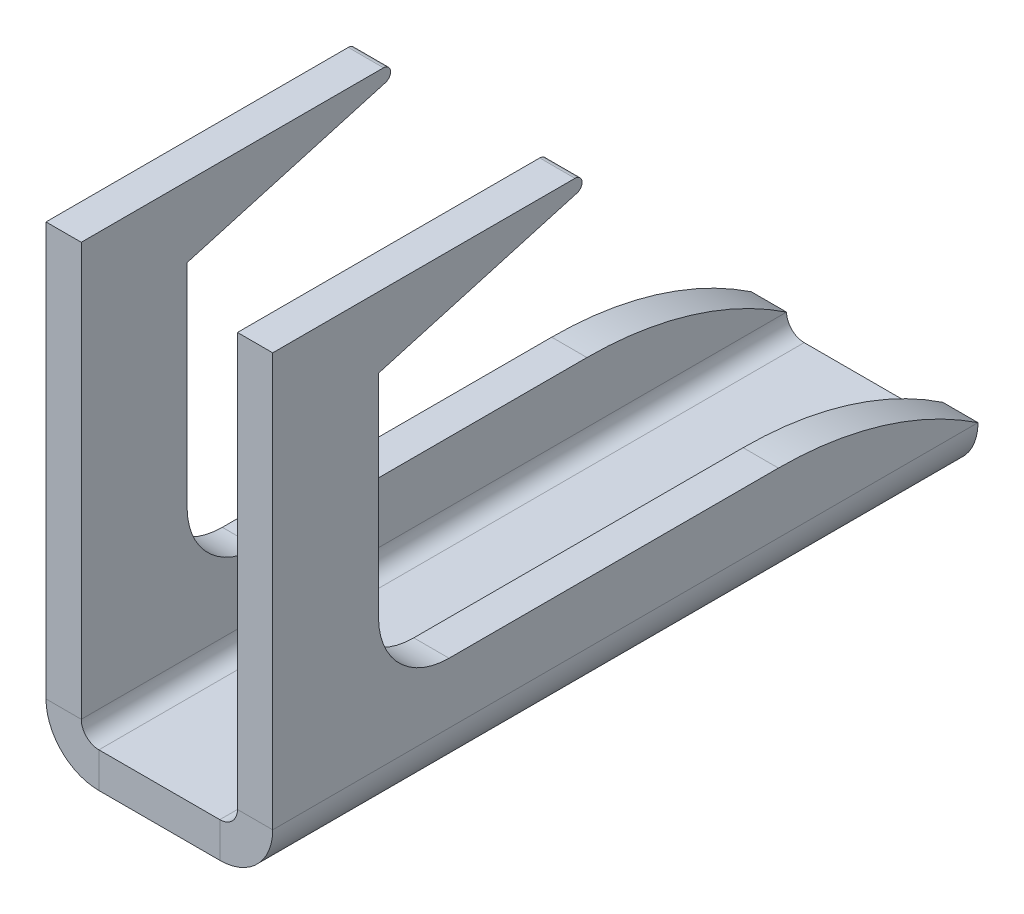
ISO-10303-21;
HEADER;
FILE_DESCRIPTION(('STEP AP214'),'2;1');
FILE_NAME('part.step','',(''),(''),'','','');
FILE_SCHEMA(('AUTOMOTIVE_DESIGN { 1 0 10303 214 1 1 1 1 }'));
ENDSEC;
DATA;
#1=APPLICATION_CONTEXT('core data for automotive mechanical design processes');
#2=APPLICATION_PROTOCOL_DEFINITION('international standard','automotive_design',2000,#1);
#3=PRODUCT_CONTEXT('',#1,'mechanical');
#4=PRODUCT('Part','Part','',(#3));
#5=PRODUCT_RELATED_PRODUCT_CATEGORY('part','',(#4));
#6=PRODUCT_DEFINITION_FORMATION('','',#4);
#7=PRODUCT_DEFINITION_CONTEXT('part definition',#1,'design');
#8=PRODUCT_DEFINITION('design','',#6,#7);
#9=PRODUCT_DEFINITION_SHAPE('','',#8);
#10=(LENGTH_UNIT() NAMED_UNIT(*) SI_UNIT(.MILLI.,.METRE.));
#11=(NAMED_UNIT(*) PLANE_ANGLE_UNIT() SI_UNIT($,.RADIAN.));
#12=(NAMED_UNIT(*) SI_UNIT($,.STERADIAN.) SOLID_ANGLE_UNIT());
#13=UNCERTAINTY_MEASURE_WITH_UNIT(LENGTH_MEASURE(1.E-05),#10,'distance_accuracy_value','');
#14=(GEOMETRIC_REPRESENTATION_CONTEXT(3) GLOBAL_UNCERTAINTY_ASSIGNED_CONTEXT((#13)) GLOBAL_UNIT_ASSIGNED_CONTEXT((#10,
#11,#12)) REPRESENTATION_CONTEXT('',''));
#15=CARTESIAN_POINT('',(0.,0.,0.));
#16=DIRECTION('',(0.,0.,1.));
#17=DIRECTION('',(1.,0.,0.));
#18=AXIS2_PLACEMENT_3D('',#15,#16,#17);
#19=CARTESIAN_POINT('',(5.,-1.,0.));
#20=DIRECTION('',(0.,0.,-1.));
#21=DIRECTION('',(-1.,0.,0.));
#22=AXIS2_PLACEMENT_3D('',#19,#20,#21);
#23=PLANE('',#22);
#24=DIRECTION('',(-1.,0.,0.));
#25=VECTOR('',#24,1.);
#26=CARTESIAN_POINT('',(5.,0.,0.));
#27=LINE('',#26,#25);
#28=CARTESIAN_POINT('',(1.71460183660255,0.,0.));
#29=VERTEX_POINT('',#28);
#30=CARTESIAN_POINT('',(-1.71460183660255,0.,0.));
#31=VERTEX_POINT('',#30);
#32=EDGE_CURVE('E332',#29,#31,#27,.T.);
#33=ORIENTED_EDGE('',*,*,#32,.F.);
#34=DIRECTION('',(0.,-1.,0.));
#35=VECTOR('',#34,1.);
#36=CARTESIAN_POINT('',(1.71460183660255,-1.,0.));
#37=LINE('',#36,#35);
#38=CARTESIAN_POINT('',(1.71460183660255,-1.,0.));
#39=VERTEX_POINT('',#38);
#40=EDGE_CURVE('E319',#29,#39,#37,.T.);
#41=ORIENTED_EDGE('',*,*,#40,.T.);
#42=DIRECTION('',(-1.,0.,0.));
#43=VECTOR('',#42,1.);
#44=CARTESIAN_POINT('',(5.,-1.,0.));
#45=LINE('',#44,#43);
#46=CARTESIAN_POINT('',(-1.71460183660255,-1.,0.));
#47=VERTEX_POINT('',#46);
#48=EDGE_CURVE('E307',#39,#47,#45,.T.);
#49=ORIENTED_EDGE('',*,*,#48,.T.);
#50=DIRECTION('',(0.,-1.,0.));
#51=VECTOR('',#50,1.);
#52=CARTESIAN_POINT('',(-1.71460183660255,-1.,0.));
#53=LINE('',#52,#51);
#54=EDGE_CURVE('E313',#31,#47,#53,.T.);
#55=ORIENTED_EDGE('',*,*,#54,.F.);
#56=EDGE_LOOP('',(#33,#41,#49,#55));
#57=FACE_BOUND('',#56,.T.);
#58=ADVANCED_FACE('F43',(#57),#23,.T.);
#59=CARTESIAN_POINT('',(-15.,-1.,20.));
#60=DIRECTION('',(0.,0.,1.));
#61=DIRECTION('',(1.,0.,0.));
#62=AXIS2_PLACEMENT_3D('',#59,#60,#61);
#63=PLANE('',#62);
#64=DIRECTION('',(1.,0.,0.));
#65=VECTOR('',#64,1.);
#66=CARTESIAN_POINT('',(-15.,-1.,20.));
#67=LINE('',#66,#65);
#68=CARTESIAN_POINT('',(-1.71460183660255,-1.,20.));
#69=VERTEX_POINT('',#68);
#70=CARTESIAN_POINT('',(1.71460183660255,-1.,20.));
#71=VERTEX_POINT('',#70);
#72=EDGE_CURVE('E329',#69,#71,#67,.T.);
#73=ORIENTED_EDGE('',*,*,#72,.T.);
#74=DIRECTION('',(0.,1.,0.));
#75=VECTOR('',#74,1.);
#76=CARTESIAN_POINT('',(1.71460183660255,-1.,20.));
#77=LINE('',#76,#75);
#78=CARTESIAN_POINT('',(1.71460183660255,0.,20.));
#79=VERTEX_POINT('',#78);
#80=EDGE_CURVE('E325',#71,#79,#77,.T.);
#81=ORIENTED_EDGE('',*,*,#80,.T.);
#82=DIRECTION('',(1.,0.,0.));
#83=VECTOR('',#82,1.);
#84=CARTESIAN_POINT('',(-15.,0.,20.));
#85=LINE('',#84,#83);
#86=CARTESIAN_POINT('',(-1.71460183660255,0.,20.));
#87=VERTEX_POINT('',#86);
#88=EDGE_CURVE('E298',#87,#79,#85,.T.);
#89=ORIENTED_EDGE('',*,*,#88,.F.);
#90=DIRECTION('',(0.,1.,0.));
#91=VECTOR('',#90,1.);
#92=CARTESIAN_POINT('',(-1.71460183660255,-1.,20.));
#93=LINE('',#92,#91);
#94=EDGE_CURVE('E306',#69,#87,#93,.T.);
#95=ORIENTED_EDGE('',*,*,#94,.F.);
#96=EDGE_LOOP('',(#73,#81,#89,#95));
#97=FACE_BOUND('',#96,.T.);
#98=ADVANCED_FACE('F401',(#97),#63,.T.);
#99=CARTESIAN_POINT('',(-7.,-1.,15.));
#100=DIRECTION('',(0.,-1.,0.));
#101=DIRECTION('',(0.,0.,-1.));
#102=AXIS2_PLACEMENT_3D('',#99,#100,#101);
#103=PLANE('',#102);
#104=ORIENTED_EDGE('',*,*,#48,.F.);
#105=DIRECTION('',(0.,0.,1.));
#106=VECTOR('',#105,1.);
#107=CARTESIAN_POINT('',(1.71460183660255,-1.,15.));
#108=LINE('',#107,#106);
#109=EDGE_CURVE('E316',#39,#71,#108,.T.);
#110=ORIENTED_EDGE('',*,*,#109,.T.);
#111=ORIENTED_EDGE('',*,*,#72,.F.);
#112=DIRECTION('',(0.,0.,1.));
#113=VECTOR('',#112,1.);
#114=CARTESIAN_POINT('',(-1.71460183660255,-1.,15.));
#115=LINE('',#114,#113);
#116=EDGE_CURVE('E303',#47,#69,#115,.T.);
#117=ORIENTED_EDGE('',*,*,#116,.F.);
#118=EDGE_LOOP('',(#104,#110,#111,#117));
#119=FACE_BOUND('',#118,.T.);
#120=ADVANCED_FACE('F408',(#119),#103,.T.);
#121=CARTESIAN_POINT('',(-7.,0.,15.));
#122=DIRECTION('',(0.,-1.,0.));
#123=DIRECTION('',(0.,0.,-1.));
#124=AXIS2_PLACEMENT_3D('',#121,#122,#123);
#125=PLANE('',#124);
#126=DIRECTION('',(0.,0.,1.));
#127=VECTOR('',#126,1.);
#128=CARTESIAN_POINT('',(1.71460183660255,0.,15.));
#129=LINE('',#128,#127);
#130=EDGE_CURVE('E322',#29,#79,#129,.T.);
#131=ORIENTED_EDGE('',*,*,#130,.F.);
#132=ORIENTED_EDGE('',*,*,#32,.T.);
#133=DIRECTION('',(0.,0.,1.));
#134=VECTOR('',#133,1.);
#135=CARTESIAN_POINT('',(-1.71460183660255,0.,15.));
#136=LINE('',#135,#134);
#137=EDGE_CURVE('E310',#31,#87,#136,.T.);
#138=ORIENTED_EDGE('',*,*,#137,.T.);
#139=ORIENTED_EDGE('',*,*,#88,.T.);
#140=EDGE_LOOP('',(#131,#132,#138,#139));
#141=FACE_BOUND('',#140,.T.);
#142=ADVANCED_FACE('F398',(#141),#125,.F.);
#143=CARTESIAN_POINT('',(-1.71460183660255,0.5,0.));
#144=DIRECTION('',(0.,0.,-1.));
#145=DIRECTION('',(-1.,0.,0.));
#146=AXIS2_PLACEMENT_3D('',#143,#144,#145);
#147=PLANE('',#146);
#148=DIRECTION('',(-1.,0.,0.));
#149=VECTOR('',#148,1.);
#150=CARTESIAN_POINT('',(-3.21460183660255,0.500000000000006,0.));
#151=LINE('',#150,#149);
#152=CARTESIAN_POINT('',(-2.21460183660255,0.500000000000002,0.));
#153=VERTEX_POINT('',#152);
#154=CARTESIAN_POINT('',(-3.21460183660255,0.500000000000007,0.));
#155=VERTEX_POINT('',#154);
#156=EDGE_CURVE('E239',#153,#155,#151,.T.);
#157=ORIENTED_EDGE('',*,*,#156,.F.);
#158=CARTESIAN_POINT('',(-1.71460183660255,0.5,0.));
#159=DIRECTION('',(0.,0.,-1.));
#160=DIRECTION('',(-1.,0.,0.));
#161=AXIS2_PLACEMENT_3D('',#158,#159,#160);
#162=CIRCLE('',#161,0.5);
#163=EDGE_CURVE('E242',#153,#31,#162,.F.);
#164=ORIENTED_EDGE('',*,*,#163,.T.);
#165=ORIENTED_EDGE('',*,*,#54,.T.);
#166=CARTESIAN_POINT('',(-1.71460183660255,0.5,0.));
#167=DIRECTION('',(0.,0.,1.));
#168=DIRECTION('',(-1.,0.,0.));
#169=AXIS2_PLACEMENT_3D('',#166,#167,#168);
#170=CIRCLE('',#169,1.5);
#171=EDGE_CURVE('E291',#155,#47,#170,.T.);
#172=ORIENTED_EDGE('',*,*,#171,.F.);
#173=EDGE_LOOP('',(#157,#164,#165,#172));
#174=FACE_BOUND('',#173,.T.);
#175=ADVANCED_FACE('F429',(#174),#147,.T.);
#176=CARTESIAN_POINT('',(-1.71460183660255,0.5,20.));
#177=DIRECTION('',(0.,0.,1.));
#178=DIRECTION('',(1.,0.,0.));
#179=AXIS2_PLACEMENT_3D('',#176,#177,#178);
#180=PLANE('',#179);
#181=CARTESIAN_POINT('',(-1.71460183660255,0.5,20.));
#182=DIRECTION('',(0.,0.,-1.));
#183=DIRECTION('',(-1.,0.,0.));
#184=AXIS2_PLACEMENT_3D('',#181,#182,#183);
#185=CIRCLE('',#184,0.5);
#186=CARTESIAN_POINT('',(-2.21460183660255,0.500000000000002,20.));
#187=VERTEX_POINT('',#186);
#188=EDGE_CURVE('E295',#87,#187,#185,.T.);
#189=ORIENTED_EDGE('',*,*,#188,.T.);
#190=DIRECTION('',(1.,0.,0.));
#191=VECTOR('',#190,1.);
#192=CARTESIAN_POINT('',(-3.21460183660255,0.500000000000006,20.));
#193=LINE('',#192,#191);
#194=CARTESIAN_POINT('',(-3.21460183660255,0.500000000000006,20.));
#195=VERTEX_POINT('',#194);
#196=EDGE_CURVE('E258',#195,#187,#193,.T.);
#197=ORIENTED_EDGE('',*,*,#196,.F.);
#198=CARTESIAN_POINT('',(-1.71460183660255,0.5,20.));
#199=DIRECTION('',(0.,0.,-1.));
#200=DIRECTION('',(1.,0.,0.));
#201=AXIS2_PLACEMENT_3D('',#198,#199,#200);
#202=CIRCLE('',#201,1.5);
#203=EDGE_CURVE('E294',#69,#195,#202,.T.);
#204=ORIENTED_EDGE('',*,*,#203,.F.);
#205=ORIENTED_EDGE('',*,*,#94,.T.);
#206=EDGE_LOOP('',(#189,#197,#204,#205));
#207=FACE_BOUND('',#206,.T.);
#208=ADVANCED_FACE('F416',(#207),#180,.T.);
#209=CARTESIAN_POINT('',(-1.71460183660255,0.5,30.0864979799932));
#210=DIRECTION('',(0.,0.,-1.));
#211=DIRECTION('',(-1.,0.,0.));
#212=AXIS2_PLACEMENT_3D('',#209,#210,#211);
#213=CYLINDRICAL_SURFACE('',#212,1.5);
#214=ORIENTED_EDGE('',*,*,#116,.T.);
#215=ORIENTED_EDGE('',*,*,#203,.T.);
#216=DIRECTION('',(0.,0.,1.));
#217=VECTOR('',#216,1.);
#218=CARTESIAN_POINT('',(-3.21460183660255,0.500000000000006,15.));
#219=LINE('',#218,#217);
#220=EDGE_CURVE('E264',#155,#195,#219,.T.);
#221=ORIENTED_EDGE('',*,*,#220,.F.);
#222=ORIENTED_EDGE('',*,*,#171,.T.);
#223=EDGE_LOOP('',(#214,#215,#221,#222));
#224=FACE_BOUND('',#223,.T.);
#225=ADVANCED_FACE('F411',(#224),#213,.T.);
#226=CARTESIAN_POINT('',(-1.71460183660255,0.5,30.0864979799932));
#227=DIRECTION('',(0.,0.,-1.));
#228=DIRECTION('',(-1.,0.,0.));
#229=AXIS2_PLACEMENT_3D('',#226,#227,#228);
#230=CYLINDRICAL_SURFACE('',#229,0.5);
#231=ORIENTED_EDGE('',*,*,#137,.F.);
#232=ORIENTED_EDGE('',*,*,#163,.F.);
#233=DIRECTION('',(0.,0.,1.));
#234=VECTOR('',#233,1.);
#235=CARTESIAN_POINT('',(-2.21460183660255,0.500000000000003,15.));
#236=LINE('',#235,#234);
#237=EDGE_CURVE('E235',#153,#187,#236,.T.);
#238=ORIENTED_EDGE('',*,*,#237,.T.);
#239=ORIENTED_EDGE('',*,*,#188,.F.);
#240=EDGE_LOOP('',(#231,#232,#238,#239));
#241=FACE_BOUND('',#240,.T.);
#242=ADVANCED_FACE('F425',(#241),#230,.F.);
#243=CARTESIAN_POINT('',(-3.21460183660254,2.21460183660256,0.));
#244=DIRECTION('',(0.,1.,0.));
#245=DIRECTION('',(0.,0.,1.));
#246=AXIS2_PLACEMENT_3D('',#243,#244,#245);
#247=PLANE('',#246);
#248=DIRECTION('',(0.,0.,1.));
#249=VECTOR('',#248,1.);
#250=CARTESIAN_POINT('',(-2.21460183660254,2.21460183660255,0.));
#251=LINE('',#250,#249);
#252=CARTESIAN_POINT('',(-2.21460183660254,2.21460183660255,5.66021360097048));
#253=VERTEX_POINT('',#252);
#254=CARTESIAN_POINT('',(-2.21460183660254,2.21460183660255,15.));
#255=VERTEX_POINT('',#254);
#256=EDGE_CURVE('E256',#253,#255,#251,.T.);
#257=ORIENTED_EDGE('',*,*,#256,.F.);
#258=DIRECTION('',(1.,0.,0.));
#259=VECTOR('',#258,1.);
#260=CARTESIAN_POINT('',(-3.21460183660254,2.21460183660256,5.66021360097048));
#261=LINE('',#260,#259);
#262=CARTESIAN_POINT('',(-3.21460183660254,2.21460183660256,5.66021360097048));
#263=VERTEX_POINT('',#262);
#264=EDGE_CURVE('E51',#253,#263,#261,.F.);
#265=ORIENTED_EDGE('',*,*,#264,.T.);
#266=DIRECTION('',(0.,0.,1.));
#267=VECTOR('',#266,1.);
#268=CARTESIAN_POINT('',(-3.21460183660254,2.21460183660256,0.));
#269=LINE('',#268,#267);
#270=CARTESIAN_POINT('',(-3.21460183660254,2.21460183660255,15.));
#271=VERTEX_POINT('',#270);
#272=EDGE_CURVE('E287',#263,#271,#269,.T.);
#273=ORIENTED_EDGE('',*,*,#272,.T.);
#274=DIRECTION('',(1.,0.,0.));
#275=VECTOR('',#274,1.);
#276=CARTESIAN_POINT('',(-3.21460183660254,2.21460183660255,15.));
#277=LINE('',#276,#275);
#278=EDGE_CURVE('E284',#271,#255,#277,.T.);
#279=ORIENTED_EDGE('',*,*,#278,.T.);
#280=EDGE_LOOP('',(#257,#265,#273,#279));
#281=FACE_BOUND('',#280,.T.);
#282=ADVANCED_FACE('F437',(#281),#247,.T.);
#283=CARTESIAN_POINT('',(-3.21460183660254,4.21460183660256,15.));
#284=DIRECTION('',(1.,0.,0.));
#285=DIRECTION('',(0.,0.,1.));
#286=AXIS2_PLACEMENT_3D('',#283,#284,#285);
#287=CYLINDRICAL_SURFACE('',#286,2.);
#288=CARTESIAN_POINT('',(-2.21460183660254,4.21460183660255,15.));
#289=DIRECTION('',(-1.,0.,0.));
#290=DIRECTION('',(0.,0.,-1.));
#291=AXIS2_PLACEMENT_3D('',#288,#289,#290);
#292=CIRCLE('',#291,2.);
#293=CARTESIAN_POINT('',(-2.21460183660254,4.21460183660255,17.));
#294=VERTEX_POINT('',#293);
#295=EDGE_CURVE('E253',#255,#294,#292,.T.);
#296=ORIENTED_EDGE('',*,*,#295,.F.);
#297=ORIENTED_EDGE('',*,*,#278,.F.);
#298=CARTESIAN_POINT('',(-3.21460183660254,4.21460183660256,15.));
#299=DIRECTION('',(-1.,0.,0.));
#300=DIRECTION('',(0.,0.,-1.));
#301=AXIS2_PLACEMENT_3D('',#298,#299,#300);
#302=CIRCLE('',#301,2.);
#303=CARTESIAN_POINT('',(-3.21460183660254,4.21460183660256,17.));
#304=VERTEX_POINT('',#303);
#305=EDGE_CURVE('E281',#271,#304,#302,.T.);
#306=ORIENTED_EDGE('',*,*,#305,.T.);
#307=DIRECTION('',(1.,0.,0.));
#308=VECTOR('',#307,1.);
#309=CARTESIAN_POINT('',(-3.21460183660254,4.21460183660256,17.));
#310=LINE('',#309,#308);
#311=EDGE_CURVE('E279',#304,#294,#310,.T.);
#312=ORIENTED_EDGE('',*,*,#311,.T.);
#313=EDGE_LOOP('',(#296,#297,#306,#312));
#314=FACE_BOUND('',#313,.T.);
#315=ADVANCED_FACE('F440',(#314),#287,.F.);
#316=CARTESIAN_POINT('',(-3.21460183660254,4.21460183660256,17.));
#317=DIRECTION('',(0.,0.,-1.));
#318=DIRECTION('',(0.,1.,0.));
#319=AXIS2_PLACEMENT_3D('',#316,#317,#318);
#320=PLANE('',#319);
#321=DIRECTION('',(0.,1.,0.));
#322=VECTOR('',#321,1.);
#323=CARTESIAN_POINT('',(-2.21460183660254,4.21460183660255,17.));
#324=LINE('',#323,#322);
#325=CARTESIAN_POINT('',(-2.21460183660251,10.2146018366026,17.));
#326=VERTEX_POINT('',#325);
#327=EDGE_CURVE('E250',#294,#326,#324,.T.);
#328=ORIENTED_EDGE('',*,*,#327,.F.);
#329=ORIENTED_EDGE('',*,*,#311,.F.);
#330=DIRECTION('',(0.,1.,0.));
#331=VECTOR('',#330,1.);
#332=CARTESIAN_POINT('',(-3.21460183660254,4.21460183660256,17.));
#333=LINE('',#332,#331);
#334=CARTESIAN_POINT('',(-3.21460183660251,10.2146018366026,17.));
#335=VERTEX_POINT('',#334);
#336=EDGE_CURVE('E276',#304,#335,#333,.T.);
#337=ORIENTED_EDGE('',*,*,#336,.T.);
#338=DIRECTION('',(1.,0.,0.));
#339=VECTOR('',#338,1.);
#340=CARTESIAN_POINT('',(-3.21460183660251,10.2146018366026,17.));
#341=LINE('',#340,#339);
#342=EDGE_CURVE('E274',#335,#326,#341,.T.);
#343=ORIENTED_EDGE('',*,*,#342,.T.);
#344=EDGE_LOOP('',(#328,#329,#337,#343));
#345=FACE_BOUND('',#344,.T.);
#346=ADVANCED_FACE('F444',(#345),#320,.T.);
#347=CARTESIAN_POINT('',(-3.21460183660251,10.2146018366026,17.));
#348=DIRECTION('',(0.,-0.961523947640823,-0.274721127897378));
#349=DIRECTION('',(0.,0.274721127897378,-0.961523947640823));
#350=AXIS2_PLACEMENT_3D('',#347,#348,#349);
#351=PLANE('',#350);
#352=DIRECTION('',(0.,0.274721127897378,-0.961523947640823));
#353=VECTOR('',#352,1.);
#354=CARTESIAN_POINT('',(-3.21460183660251,10.2146018366026,17.));
#355=LINE('',#354,#353);
#356=CARTESIAN_POINT('',(-3.21460183660251,11.8222970470744,11.3730667633486));
#357=VERTEX_POINT('',#356);
#358=EDGE_CURVE('E271',#335,#357,#355,.T.);
#359=ORIENTED_EDGE('',*,*,#358,.T.);
#360=DIRECTION('',(1.,0.,0.));
#361=VECTOR('',#360,1.);
#362=CARTESIAN_POINT('',(-3.21460183660251,11.8222970470744,11.3730667633486));
#363=LINE('',#362,#361);
#364=CARTESIAN_POINT('',(-2.21460183660251,11.8222970470744,11.3730667633486));
#365=VERTEX_POINT('',#364);
#366=EDGE_CURVE('E344',#357,#365,#363,.T.);
#367=ORIENTED_EDGE('',*,*,#366,.T.);
#368=DIRECTION('',(0.,0.274721127897378,-0.961523947640823));
#369=VECTOR('',#368,1.);
#370=CARTESIAN_POINT('',(-2.21460183660251,10.2146018366026,17.));
#371=LINE('',#370,#369);
#372=EDGE_CURVE('E247',#326,#365,#371,.T.);
#373=ORIENTED_EDGE('',*,*,#372,.F.);
#374=ORIENTED_EDGE('',*,*,#342,.F.);
#375=EDGE_LOOP('',(#359,#367,#373,#374));
#376=FACE_BOUND('',#375,.T.);
#377=ADVANCED_FACE('F447',(#376),#351,.T.);
#378=CARTESIAN_POINT('',(-3.21460183660251,12.2146018366026,10.));
#379=DIRECTION('',(0.,1.,0.));
#380=DIRECTION('',(0.,0.,1.));
#381=AXIS2_PLACEMENT_3D('',#378,#379,#380);
#382=PLANE('',#381);
#383=DIRECTION('',(0.,0.,1.));
#384=VECTOR('',#383,1.);
#385=CARTESIAN_POINT('',(-2.21460183660251,12.2146018366025,10.));
#386=LINE('',#385,#384);
#387=CARTESIAN_POINT('',(-2.21460183660251,12.2146018366025,11.4280109889281));
#388=VERTEX_POINT('',#387);
#389=CARTESIAN_POINT('',(-2.21460183660251,12.2146018366026,20.));
#390=VERTEX_POINT('',#389);
#391=EDGE_CURVE('E245',#388,#390,#386,.T.);
#392=ORIENTED_EDGE('',*,*,#391,.F.);
#393=DIRECTION('',(1.,0.,0.));
#394=VECTOR('',#393,1.);
#395=CARTESIAN_POINT('',(-3.21460183660251,12.2146018366026,11.4280109889281));
#396=LINE('',#395,#394);
#397=CARTESIAN_POINT('',(-3.21460183660251,12.2146018366026,11.4280109889281));
#398=VERTEX_POINT('',#397);
#399=EDGE_CURVE('E349',#388,#398,#396,.F.);
#400=ORIENTED_EDGE('',*,*,#399,.T.);
#401=DIRECTION('',(0.,0.,1.));
#402=VECTOR('',#401,1.);
#403=CARTESIAN_POINT('',(-3.21460183660251,12.2146018366026,10.));
#404=LINE('',#403,#402);
#405=CARTESIAN_POINT('',(-3.21460183660251,12.2146018366026,20.));
#406=VERTEX_POINT('',#405);
#407=EDGE_CURVE('E269',#398,#406,#404,.T.);
#408=ORIENTED_EDGE('',*,*,#407,.T.);
#409=DIRECTION('',(1.,0.,0.));
#410=VECTOR('',#409,1.);
#411=CARTESIAN_POINT('',(-3.21460183660251,12.2146018366026,20.));
#412=LINE('',#411,#410);
#413=EDGE_CURVE('E266',#406,#390,#412,.T.);
#414=ORIENTED_EDGE('',*,*,#413,.T.);
#415=EDGE_LOOP('',(#392,#400,#408,#414));
#416=FACE_BOUND('',#415,.T.);
#417=ADVANCED_FACE('F455',(#416),#382,.T.);
#418=CARTESIAN_POINT('',(-3.21460183660254,4.21460183660256,15.));
#419=DIRECTION('',(-1.,0.,0.));
#420=DIRECTION('',(0.,0.,-1.));
#421=AXIS2_PLACEMENT_3D('',#418,#419,#420);
#422=PLANE('',#421);
#423=ORIENTED_EDGE('',*,*,#272,.F.);
#424=CARTESIAN_POINT('',(-3.21460183660258,-7.98539816339744,5.66021360097048));
#425=DIRECTION('',(-1.,0.,0.));
#426=DIRECTION('',(0.,-1.,0.));
#427=AXIS2_PLACEMENT_3D('',#424,#425,#426);
#428=CIRCLE('',#427,10.2);
#429=EDGE_CURVE('E12',#263,#155,#428,.T.);
#430=ORIENTED_EDGE('',*,*,#429,.T.);
#431=ORIENTED_EDGE('',*,*,#220,.T.);
#432=DIRECTION('',(0.,-1.,0.));
#433=VECTOR('',#432,1.);
#434=CARTESIAN_POINT('',(-3.21460183660251,12.2146018366026,20.));
#435=LINE('',#434,#433);
#436=EDGE_CURVE('E261',#406,#195,#435,.T.);
#437=ORIENTED_EDGE('',*,*,#436,.F.);
#438=ORIENTED_EDGE('',*,*,#407,.F.);
#439=CARTESIAN_POINT('',(-3.21460183660251,12.0146018366026,11.4280109889281));
#440=DIRECTION('',(-1.,0.,0.));
#441=DIRECTION('',(0.,-1.,0.));
#442=AXIS2_PLACEMENT_3D('',#439,#440,#441);
#443=CIRCLE('',#442,0.2);
#444=EDGE_CURVE('E351',#398,#357,#443,.T.);
#445=ORIENTED_EDGE('',*,*,#444,.T.);
#446=ORIENTED_EDGE('',*,*,#358,.F.);
#447=ORIENTED_EDGE('',*,*,#336,.F.);
#448=ORIENTED_EDGE('',*,*,#305,.F.);
#449=EDGE_LOOP('',(#423,#430,#431,#437,#438,#445,#446,#447,#448));
#450=FACE_BOUND('',#449,.T.);
#451=ADVANCED_FACE('F433',(#450),#422,.T.);
#452=CARTESIAN_POINT('',(-3.21460183660251,12.2146018366026,20.));
#453=DIRECTION('',(0.,0.,1.));
#454=DIRECTION('',(0.,-1.,0.));
#455=AXIS2_PLACEMENT_3D('',#452,#453,#454);
#456=PLANE('',#455);
#457=ORIENTED_EDGE('',*,*,#436,.T.);
#458=ORIENTED_EDGE('',*,*,#196,.T.);
#459=DIRECTION('',(0.,-1.,0.));
#460=VECTOR('',#459,1.);
#461=CARTESIAN_POINT('',(-2.21460183660251,12.2146018366026,20.));
#462=LINE('',#461,#460);
#463=EDGE_CURVE('E243',#390,#187,#462,.T.);
#464=ORIENTED_EDGE('',*,*,#463,.F.);
#465=ORIENTED_EDGE('',*,*,#413,.F.);
#466=EDGE_LOOP('',(#457,#458,#464,#465));
#467=FACE_BOUND('',#466,.T.);
#468=ADVANCED_FACE('F420',(#467),#456,.T.);
#469=CARTESIAN_POINT('',(-2.21460183660254,4.21460183660255,15.));
#470=DIRECTION('',(-1.,0.,0.));
#471=DIRECTION('',(0.,0.,-1.));
#472=AXIS2_PLACEMENT_3D('',#469,#470,#471);
#473=PLANE('',#472);
#474=ORIENTED_EDGE('',*,*,#237,.F.);
#475=CARTESIAN_POINT('',(-2.21460183660258,-7.98539816339745,5.66021360097048));
#476=DIRECTION('',(-1.,0.,0.));
#477=DIRECTION('',(0.,-1.,0.));
#478=AXIS2_PLACEMENT_3D('',#475,#476,#477);
#479=CIRCLE('',#478,10.2);
#480=EDGE_CURVE('E65',#153,#253,#479,.F.);
#481=ORIENTED_EDGE('',*,*,#480,.T.);
#482=ORIENTED_EDGE('',*,*,#256,.T.);
#483=ORIENTED_EDGE('',*,*,#295,.T.);
#484=ORIENTED_EDGE('',*,*,#327,.T.);
#485=ORIENTED_EDGE('',*,*,#372,.T.);
#486=CARTESIAN_POINT('',(-2.21460183660251,12.0146018366025,11.4280109889281));
#487=DIRECTION('',(-1.,0.,0.));
#488=DIRECTION('',(0.,-1.,0.));
#489=AXIS2_PLACEMENT_3D('',#486,#487,#488);
#490=CIRCLE('',#489,0.2);
#491=EDGE_CURVE('E347',#365,#388,#490,.F.);
#492=ORIENTED_EDGE('',*,*,#491,.T.);
#493=ORIENTED_EDGE('',*,*,#391,.T.);
#494=ORIENTED_EDGE('',*,*,#463,.T.);
#495=EDGE_LOOP('',(#474,#481,#482,#483,#484,#485,#492,#493,#494));
#496=FACE_BOUND('',#495,.T.);
#497=ADVANCED_FACE('F427',(#496),#473,.F.);
#498=CARTESIAN_POINT('',(1.71460183660255,0.5,0.));
#499=DIRECTION('',(0.,0.,-1.));
#500=DIRECTION('',(-1.,0.,0.));
#501=AXIS2_PLACEMENT_3D('',#498,#499,#500);
#502=PLANE('',#501);
#503=ORIENTED_EDGE('',*,*,#40,.F.);
#504=CARTESIAN_POINT('',(1.71460183660255,0.5,0.));
#505=DIRECTION('',(0.,0.,1.));
#506=DIRECTION('',(1.,0.,0.));
#507=AXIS2_PLACEMENT_3D('',#504,#505,#506);
#508=CIRCLE('',#507,0.5);
#509=CARTESIAN_POINT('',(2.21460183660255,0.500000000000003,0.));
#510=VERTEX_POINT('',#509);
#511=EDGE_CURVE('E210',#29,#510,#508,.T.);
#512=ORIENTED_EDGE('',*,*,#511,.T.);
#513=DIRECTION('',(1.,0.,0.));
#514=VECTOR('',#513,1.);
#515=CARTESIAN_POINT('',(3.21460183660255,0.500000000000006,0.));
#516=LINE('',#515,#514);
#517=CARTESIAN_POINT('',(3.21460183660255,0.500000000000007,0.));
#518=VERTEX_POINT('',#517);
#519=EDGE_CURVE('E217',#510,#518,#516,.T.);
#520=ORIENTED_EDGE('',*,*,#519,.T.);
#521=CARTESIAN_POINT('',(1.71460183660255,0.5,0.));
#522=DIRECTION('',(0.,0.,1.));
#523=DIRECTION('',(-1.,0.,0.));
#524=AXIS2_PLACEMENT_3D('',#521,#522,#523);
#525=CIRCLE('',#524,1.5);
#526=EDGE_CURVE('E228',#39,#518,#525,.T.);
#527=ORIENTED_EDGE('',*,*,#526,.F.);
#528=EDGE_LOOP('',(#503,#512,#520,#527));
#529=FACE_BOUND('',#528,.T.);
#530=ADVANCED_FACE('F390',(#529),#502,.T.);
#531=CARTESIAN_POINT('',(1.71460183660255,0.5,20.));
#532=DIRECTION('',(0.,0.,1.));
#533=DIRECTION('',(1.,0.,0.));
#534=AXIS2_PLACEMENT_3D('',#531,#532,#533);
#535=PLANE('',#534);
#536=CARTESIAN_POINT('',(1.71460183660255,0.5,20.));
#537=DIRECTION('',(0.,0.,1.));
#538=DIRECTION('',(1.,0.,0.));
#539=AXIS2_PLACEMENT_3D('',#536,#537,#538);
#540=CIRCLE('',#539,0.5);
#541=CARTESIAN_POINT('',(2.21460183660255,0.500000000000002,20.));
#542=VERTEX_POINT('',#541);
#543=EDGE_CURVE('E232',#542,#79,#540,.F.);
#544=ORIENTED_EDGE('',*,*,#543,.T.);
#545=ORIENTED_EDGE('',*,*,#80,.F.);
#546=CARTESIAN_POINT('',(1.71460183660255,0.5,20.));
#547=DIRECTION('',(0.,0.,-1.));
#548=DIRECTION('',(1.,0.,0.));
#549=AXIS2_PLACEMENT_3D('',#546,#547,#548);
#550=CIRCLE('',#549,1.5);
#551=CARTESIAN_POINT('',(3.21460183660255,0.500000000000004,20.));
#552=VERTEX_POINT('',#551);
#553=EDGE_CURVE('E231',#552,#71,#550,.T.);
#554=ORIENTED_EDGE('',*,*,#553,.F.);
#555=DIRECTION('',(-1.,0.,0.));
#556=VECTOR('',#555,1.);
#557=CARTESIAN_POINT('',(3.21460183660255,0.500000000000006,20.));
#558=LINE('',#557,#556);
#559=EDGE_CURVE('E196',#552,#542,#558,.T.);
#560=ORIENTED_EDGE('',*,*,#559,.T.);
#561=EDGE_LOOP('',(#544,#545,#554,#560));
#562=FACE_BOUND('',#561,.T.);
#563=ADVANCED_FACE('F404',(#562),#535,.T.);
#564=CARTESIAN_POINT('',(1.71460183660255,0.5,-10.0864979799932));
#565=DIRECTION('',(0.,0.,1.));
#566=DIRECTION('',(1.,0.,0.));
#567=AXIS2_PLACEMENT_3D('',#564,#565,#566);
#568=CYLINDRICAL_SURFACE('',#567,1.5);
#569=DIRECTION('',(0.,0.,1.));
#570=VECTOR('',#569,1.);
#571=CARTESIAN_POINT('',(3.21460183660255,0.500000000000007,15.));
#572=LINE('',#571,#570);
#573=EDGE_CURVE('E226',#518,#552,#572,.T.);
#574=ORIENTED_EDGE('',*,*,#573,.T.);
#575=ORIENTED_EDGE('',*,*,#553,.T.);
#576=ORIENTED_EDGE('',*,*,#109,.F.);
#577=ORIENTED_EDGE('',*,*,#526,.T.);
#578=EDGE_LOOP('',(#574,#575,#576,#577));
#579=FACE_BOUND('',#578,.T.);
#580=ADVANCED_FACE('F406',(#579),#568,.T.);
#581=CARTESIAN_POINT('',(1.71460183660255,0.5,-10.0864979799932));
#582=DIRECTION('',(0.,0.,1.));
#583=DIRECTION('',(1.,0.,0.));
#584=AXIS2_PLACEMENT_3D('',#581,#582,#583);
#585=CYLINDRICAL_SURFACE('',#584,0.5);
#586=DIRECTION('',(0.,0.,1.));
#587=VECTOR('',#586,1.);
#588=CARTESIAN_POINT('',(2.21460183660255,0.500000000000003,15.));
#589=LINE('',#588,#587);
#590=EDGE_CURVE('E374',#510,#542,#589,.T.);
#591=ORIENTED_EDGE('',*,*,#590,.F.);
#592=ORIENTED_EDGE('',*,*,#511,.F.);
#593=ORIENTED_EDGE('',*,*,#130,.T.);
#594=ORIENTED_EDGE('',*,*,#543,.F.);
#595=EDGE_LOOP('',(#591,#592,#593,#594));
#596=FACE_BOUND('',#595,.T.);
#597=ADVANCED_FACE('F385',(#596),#585,.F.);
#598=CARTESIAN_POINT('',(3.21460183660251,12.2146018366026,10.));
#599=DIRECTION('',(0.,1.,0.));
#600=DIRECTION('',(0.,0.,-1.));
#601=AXIS2_PLACEMENT_3D('',#598,#599,#600);
#602=PLANE('',#601);
#603=DIRECTION('',(0.,0.,-1.));
#604=VECTOR('',#603,1.);
#605=CARTESIAN_POINT('',(3.21460183660251,12.2146018366026,10.));
#606=LINE('',#605,#604);
#607=CARTESIAN_POINT('',(3.21460183660251,12.2146018366026,20.));
#608=VERTEX_POINT('',#607);
#609=CARTESIAN_POINT('',(3.21460183660251,12.2146018366026,11.4280109889281));
#610=VERTEX_POINT('',#609);
#611=EDGE_CURVE('E206',#608,#610,#606,.T.);
#612=ORIENTED_EDGE('',*,*,#611,.T.);
#613=DIRECTION('',(-1.,0.,0.));
#614=VECTOR('',#613,1.);
#615=CARTESIAN_POINT('',(3.21460183660251,12.2146018366026,11.4280109889281));
#616=LINE('',#615,#614);
#617=CARTESIAN_POINT('',(2.21460183660251,12.2146018366026,11.4280109889281));
#618=VERTEX_POINT('',#617);
#619=EDGE_CURVE('E328',#610,#618,#616,.T.);
#620=ORIENTED_EDGE('',*,*,#619,.T.);
#621=DIRECTION('',(0.,0.,-1.));
#622=VECTOR('',#621,1.);
#623=CARTESIAN_POINT('',(2.21460183660251,12.2146018366026,10.));
#624=LINE('',#623,#622);
#625=CARTESIAN_POINT('',(2.21460183660251,12.2146018366026,20.));
#626=VERTEX_POINT('',#625);
#627=EDGE_CURVE('E209',#626,#618,#624,.T.);
#628=ORIENTED_EDGE('',*,*,#627,.F.);
#629=DIRECTION('',(-1.,0.,0.));
#630=VECTOR('',#629,1.);
#631=CARTESIAN_POINT('',(3.21460183660251,12.2146018366026,20.));
#632=LINE('',#631,#630);
#633=EDGE_CURVE('E193',#608,#626,#632,.T.);
#634=ORIENTED_EDGE('',*,*,#633,.F.);
#635=EDGE_LOOP('',(#612,#620,#628,#634));
#636=FACE_BOUND('',#635,.T.);
#637=ADVANCED_FACE('F204',(#636),#602,.T.);
#638=CARTESIAN_POINT('',(3.21460183660252,10.2146018366026,17.));
#639=DIRECTION('',(0.,-0.961523947640823,-0.274721127897378));
#640=DIRECTION('',(0.,-0.274721127897378,0.961523947640823));
#641=AXIS2_PLACEMENT_3D('',#638,#639,#640);
#642=PLANE('',#641);
#643=DIRECTION('',(0.,-0.274721127897378,0.961523947640823));
#644=VECTOR('',#643,1.);
#645=CARTESIAN_POINT('',(2.21460183660252,10.2146018366026,17.));
#646=LINE('',#645,#644);
#647=CARTESIAN_POINT('',(2.21460183660251,11.8222970470744,11.3730667633486));
#648=VERTEX_POINT('',#647);
#649=CARTESIAN_POINT('',(2.21460183660252,10.2146018366026,17.));
#650=VERTEX_POINT('',#649);
#651=EDGE_CURVE('E785',#648,#650,#646,.T.);
#652=ORIENTED_EDGE('',*,*,#651,.F.);
#653=DIRECTION('',(-1.,0.,0.));
#654=VECTOR('',#653,1.);
#655=CARTESIAN_POINT('',(3.21460183660251,11.8222970470744,11.3730667633486));
#656=LINE('',#655,#654);
#657=CARTESIAN_POINT('',(3.21460183660251,11.8222970470744,11.3730667633486));
#658=VERTEX_POINT('',#657);
#659=EDGE_CURVE('E341',#648,#658,#656,.F.);
#660=ORIENTED_EDGE('',*,*,#659,.T.);
#661=DIRECTION('',(0.,-0.274721127897378,0.961523947640823));
#662=VECTOR('',#661,1.);
#663=CARTESIAN_POINT('',(3.21460183660252,10.2146018366026,17.));
#664=LINE('',#663,#662);
#665=CARTESIAN_POINT('',(3.21460183660252,10.2146018366026,17.));
#666=VERTEX_POINT('',#665);
#667=EDGE_CURVE('E216',#658,#666,#664,.T.);
#668=ORIENTED_EDGE('',*,*,#667,.T.);
#669=DIRECTION('',(-1.,0.,0.));
#670=VECTOR('',#669,1.);
#671=CARTESIAN_POINT('',(3.21460183660252,10.2146018366026,17.));
#672=LINE('',#671,#670);
#673=EDGE_CURVE('E219',#666,#650,#672,.T.);
#674=ORIENTED_EDGE('',*,*,#673,.T.);
#675=EDGE_LOOP('',(#652,#660,#668,#674));
#676=FACE_BOUND('',#675,.T.);
#677=ADVANCED_FACE('F628',(#676),#642,.T.);
#678=CARTESIAN_POINT('',(3.21460183660254,4.21460183660256,17.));
#679=DIRECTION('',(0.,0.,-1.));
#680=DIRECTION('',(0.,-1.,0.));
#681=AXIS2_PLACEMENT_3D('',#678,#679,#680);
#682=PLANE('',#681);
#683=DIRECTION('',(0.,-1.,0.));
#684=VECTOR('',#683,1.);
#685=CARTESIAN_POINT('',(2.21460183660254,4.21460183660255,17.));
#686=LINE('',#685,#684);
#687=CARTESIAN_POINT('',(2.21460183660254,4.21460183660255,17.));
#688=VERTEX_POINT('',#687);
#689=EDGE_CURVE('E778',#650,#688,#686,.T.);
#690=ORIENTED_EDGE('',*,*,#689,.F.);
#691=ORIENTED_EDGE('',*,*,#673,.F.);
#692=DIRECTION('',(0.,-1.,0.));
#693=VECTOR('',#692,1.);
#694=CARTESIAN_POINT('',(3.21460183660254,4.21460183660256,17.));
#695=LINE('',#694,#693);
#696=CARTESIAN_POINT('',(3.21460183660254,4.21460183660256,17.));
#697=VERTEX_POINT('',#696);
#698=EDGE_CURVE('E797',#666,#697,#695,.T.);
#699=ORIENTED_EDGE('',*,*,#698,.T.);
#700=DIRECTION('',(-1.,0.,0.));
#701=VECTOR('',#700,1.);
#702=CARTESIAN_POINT('',(3.21460183660254,4.21460183660256,17.));
#703=LINE('',#702,#701);
#704=EDGE_CURVE('E782',#697,#688,#703,.T.);
#705=ORIENTED_EDGE('',*,*,#704,.T.);
#706=EDGE_LOOP('',(#690,#691,#699,#705));
#707=FACE_BOUND('',#706,.T.);
#708=ADVANCED_FACE('F633',(#707),#682,.T.);
#709=CARTESIAN_POINT('',(3.21460183660254,4.21460183660256,15.));
#710=DIRECTION('',(-1.,0.,0.));
#711=DIRECTION('',(0.,0.,1.));
#712=AXIS2_PLACEMENT_3D('',#709,#710,#711);
#713=CYLINDRICAL_SURFACE('',#712,2.);
#714=CARTESIAN_POINT('',(2.21460183660254,4.21460183660255,15.));
#715=DIRECTION('',(1.,0.,0.));
#716=DIRECTION('',(0.,0.,1.));
#717=AXIS2_PLACEMENT_3D('',#714,#715,#716);
#718=CIRCLE('',#717,2.);
#719=CARTESIAN_POINT('',(2.21460183660255,2.21460183660255,15.));
#720=VERTEX_POINT('',#719);
#721=EDGE_CURVE('E784',#688,#720,#718,.T.);
#722=ORIENTED_EDGE('',*,*,#721,.F.);
#723=ORIENTED_EDGE('',*,*,#704,.F.);
#724=CARTESIAN_POINT('',(3.21460183660254,4.21460183660256,15.));
#725=DIRECTION('',(1.,0.,0.));
#726=DIRECTION('',(0.,0.,1.));
#727=AXIS2_PLACEMENT_3D('',#724,#725,#726);
#728=CIRCLE('',#727,2.);
#729=CARTESIAN_POINT('',(3.21460183660255,2.21460183660256,15.));
#730=VERTEX_POINT('',#729);
#731=EDGE_CURVE('E794',#697,#730,#728,.T.);
#732=ORIENTED_EDGE('',*,*,#731,.T.);
#733=DIRECTION('',(-1.,0.,0.));
#734=VECTOR('',#733,1.);
#735=CARTESIAN_POINT('',(3.21460183660255,2.21460183660256,15.));
#736=LINE('',#735,#734);
#737=EDGE_CURVE('E373',#730,#720,#736,.T.);
#738=ORIENTED_EDGE('',*,*,#737,.T.);
#739=EDGE_LOOP('',(#722,#723,#732,#738));
#740=FACE_BOUND('',#739,.T.);
#741=ADVANCED_FACE('F522',(#740),#713,.F.);
#742=CARTESIAN_POINT('',(3.21460183660254,2.21460183660256,0.));
#743=DIRECTION('',(0.,1.,0.));
#744=DIRECTION('',(0.,0.,-1.));
#745=AXIS2_PLACEMENT_3D('',#742,#743,#744);
#746=PLANE('',#745);
#747=DIRECTION('',(0.,0.,-1.));
#748=VECTOR('',#747,1.);
#749=CARTESIAN_POINT('',(3.21460183660254,2.21460183660256,0.));
#750=LINE('',#749,#748);
#751=CARTESIAN_POINT('',(3.21460183660254,2.21460183660255,5.66021360097048));
#752=VERTEX_POINT('',#751);
#753=EDGE_CURVE('E364',#730,#752,#750,.T.);
#754=ORIENTED_EDGE('',*,*,#753,.T.);
#755=DIRECTION('',(-1.,0.,0.));
#756=VECTOR('',#755,1.);
#757=CARTESIAN_POINT('',(2.21460183660254,2.21460183660255,5.66021360097048));
#758=LINE('',#757,#756);
#759=CARTESIAN_POINT('',(2.21460183660254,2.21460183660255,5.66021360097048));
#760=VERTEX_POINT('',#759);
#761=EDGE_CURVE('E353',#752,#760,#758,.T.);
#762=ORIENTED_EDGE('',*,*,#761,.T.);
#763=DIRECTION('',(0.,0.,-1.));
#764=VECTOR('',#763,1.);
#765=CARTESIAN_POINT('',(2.21460183660254,2.21460183660255,0.));
#766=LINE('',#765,#764);
#767=EDGE_CURVE('E200',#720,#760,#766,.T.);
#768=ORIENTED_EDGE('',*,*,#767,.F.);
#769=ORIENTED_EDGE('',*,*,#737,.F.);
#770=EDGE_LOOP('',(#754,#762,#768,#769));
#771=FACE_BOUND('',#770,.T.);
#772=ADVANCED_FACE('F370',(#771),#746,.T.);
#773=CARTESIAN_POINT('',(3.21460183660259,-9.78539816339745,15.));
#774=DIRECTION('',(1.,0.,0.));
#775=DIRECTION('',(0.,0.,-1.));
#776=AXIS2_PLACEMENT_3D('',#773,#774,#775);
#777=PLANE('',#776);
#778=ORIENTED_EDGE('',*,*,#573,.F.);
#779=CARTESIAN_POINT('',(3.21460183660258,-7.98539816339744,5.66021360097048));
#780=DIRECTION('',(1.,0.,0.));
#781=DIRECTION('',(0.,1.,0.));
#782=AXIS2_PLACEMENT_3D('',#779,#780,#781);
#783=CIRCLE('',#782,10.2);
#784=EDGE_CURVE('E358',#518,#752,#783,.T.);
#785=ORIENTED_EDGE('',*,*,#784,.T.);
#786=ORIENTED_EDGE('',*,*,#753,.F.);
#787=ORIENTED_EDGE('',*,*,#731,.F.);
#788=ORIENTED_EDGE('',*,*,#698,.F.);
#789=ORIENTED_EDGE('',*,*,#667,.F.);
#790=CARTESIAN_POINT('',(3.21460183660251,12.0146018366026,11.4280109889281));
#791=DIRECTION('',(1.,0.,0.));
#792=DIRECTION('',(0.,1.,0.));
#793=AXIS2_PLACEMENT_3D('',#790,#791,#792);
#794=CIRCLE('',#793,0.2);
#795=EDGE_CURVE('E215',#658,#610,#794,.T.);
#796=ORIENTED_EDGE('',*,*,#795,.T.);
#797=ORIENTED_EDGE('',*,*,#611,.F.);
#798=DIRECTION('',(0.,1.,0.));
#799=VECTOR('',#798,1.);
#800=CARTESIAN_POINT('',(3.21460183660262,-17.7853981633974,20.));
#801=LINE('',#800,#799);
#802=EDGE_CURVE('E190',#552,#608,#801,.T.);
#803=ORIENTED_EDGE('',*,*,#802,.F.);
#804=EDGE_LOOP('',(#778,#785,#786,#787,#788,#789,#796,#797,#803));
#805=FACE_BOUND('',#804,.T.);
#806=ADVANCED_FACE('F212',(#805),#777,.T.);
#807=CARTESIAN_POINT('',(2.21460183660259,-9.78539816339745,15.));
#808=DIRECTION('',(1.,0.,0.));
#809=DIRECTION('',(0.,0.,-1.));
#810=AXIS2_PLACEMENT_3D('',#807,#808,#809);
#811=PLANE('',#810);
#812=ORIENTED_EDGE('',*,*,#767,.T.);
#813=CARTESIAN_POINT('',(2.21460183660258,-7.98539816339745,5.66021360097048));
#814=DIRECTION('',(1.,0.,0.));
#815=DIRECTION('',(0.,1.,0.));
#816=AXIS2_PLACEMENT_3D('',#813,#814,#815);
#817=CIRCLE('',#816,10.2);
#818=EDGE_CURVE('E356',#760,#510,#817,.F.);
#819=ORIENTED_EDGE('',*,*,#818,.T.);
#820=ORIENTED_EDGE('',*,*,#590,.T.);
#821=DIRECTION('',(0.,1.,0.));
#822=VECTOR('',#821,1.);
#823=CARTESIAN_POINT('',(2.21460183660262,-17.7853981633974,20.));
#824=LINE('',#823,#822);
#825=EDGE_CURVE('E387',#542,#626,#824,.T.);
#826=ORIENTED_EDGE('',*,*,#825,.T.);
#827=ORIENTED_EDGE('',*,*,#627,.T.);
#828=CARTESIAN_POINT('',(2.21460183660251,12.0146018366026,11.4280109889281));
#829=DIRECTION('',(1.,0.,0.));
#830=DIRECTION('',(0.,1.,0.));
#831=AXIS2_PLACEMENT_3D('',#828,#829,#830);
#832=CIRCLE('',#831,0.2);
#833=EDGE_CURVE('E339',#618,#648,#832,.F.);
#834=ORIENTED_EDGE('',*,*,#833,.T.);
#835=ORIENTED_EDGE('',*,*,#651,.T.);
#836=ORIENTED_EDGE('',*,*,#689,.T.);
#837=ORIENTED_EDGE('',*,*,#721,.T.);
#838=EDGE_LOOP('',(#812,#819,#820,#826,#827,#834,#835,#836,#837));
#839=FACE_BOUND('',#838,.T.);
#840=ADVANCED_FACE('F380',(#839),#811,.F.);
#841=CARTESIAN_POINT('',(3.21460183660262,-17.7853981633974,20.));
#842=DIRECTION('',(0.,0.,1.));
#843=DIRECTION('',(0.,1.,0.));
#844=AXIS2_PLACEMENT_3D('',#841,#842,#843);
#845=PLANE('',#844);
#846=ORIENTED_EDGE('',*,*,#559,.F.);
#847=ORIENTED_EDGE('',*,*,#802,.T.);
#848=ORIENTED_EDGE('',*,*,#633,.T.);
#849=ORIENTED_EDGE('',*,*,#825,.F.);
#850=EDGE_LOOP('',(#846,#847,#848,#849));
#851=FACE_BOUND('',#850,.T.);
#852=ADVANCED_FACE('F192',(#851),#845,.T.);
#853=CARTESIAN_POINT('',(3.21460183660251,12.0146018366026,11.4280109889281));
#854=DIRECTION('',(-1.,0.,0.));
#855=DIRECTION('',(0.,-1.,0.));
#856=AXIS2_PLACEMENT_3D('',#853,#854,#855);
#857=CYLINDRICAL_SURFACE('',#856,0.2);
#858=ORIENTED_EDGE('',*,*,#795,.F.);
#859=ORIENTED_EDGE('',*,*,#659,.F.);
#860=ORIENTED_EDGE('',*,*,#833,.F.);
#861=ORIENTED_EDGE('',*,*,#619,.F.);
#862=EDGE_LOOP('',(#858,#859,#860,#861));
#863=FACE_BOUND('',#862,.T.);
#864=ADVANCED_FACE('F476',(#863),#857,.T.);
#865=CARTESIAN_POINT('',(-3.21460183660251,12.0146018366026,11.4280109889281));
#866=DIRECTION('',(1.,0.,0.));
#867=DIRECTION('',(0.,1.,0.));
#868=AXIS2_PLACEMENT_3D('',#865,#866,#867);
#869=CYLINDRICAL_SURFACE('',#868,0.2);
#870=ORIENTED_EDGE('',*,*,#444,.F.);
#871=ORIENTED_EDGE('',*,*,#399,.F.);
#872=ORIENTED_EDGE('',*,*,#491,.F.);
#873=ORIENTED_EDGE('',*,*,#366,.F.);
#874=EDGE_LOOP('',(#870,#871,#872,#873));
#875=FACE_BOUND('',#874,.T.);
#876=ADVANCED_FACE('F451',(#875),#869,.T.);
#877=CARTESIAN_POINT('',(3.21460183660258,-7.98539816339744,5.66021360097048));
#878=DIRECTION('',(1.,0.,0.));
#879=DIRECTION('',(0.,1.,0.));
#880=AXIS2_PLACEMENT_3D('',#877,#878,#879);
#881=CYLINDRICAL_SURFACE('',#880,10.2);
#882=ORIENTED_EDGE('',*,*,#784,.F.);
#883=ORIENTED_EDGE('',*,*,#519,.F.);
#884=ORIENTED_EDGE('',*,*,#818,.F.);
#885=ORIENTED_EDGE('',*,*,#761,.F.);
#886=EDGE_LOOP('',(#882,#883,#884,#885));
#887=FACE_BOUND('',#886,.T.);
#888=ADVANCED_FACE('F376',(#887),#881,.T.);
#889=CARTESIAN_POINT('',(-3.21460183660258,-7.98539816339744,5.66021360097048));
#890=DIRECTION('',(-1.,0.,0.));
#891=DIRECTION('',(0.,-1.,0.));
#892=AXIS2_PLACEMENT_3D('',#889,#890,#891);
#893=CYLINDRICAL_SURFACE('',#892,10.2);
#894=ORIENTED_EDGE('',*,*,#429,.F.);
#895=ORIENTED_EDGE('',*,*,#264,.F.);
#896=ORIENTED_EDGE('',*,*,#480,.F.);
#897=ORIENTED_EDGE('',*,*,#156,.T.);
#898=EDGE_LOOP('',(#894,#895,#896,#897));
#899=FACE_BOUND('',#898,.T.);
#900=ADVANCED_FACE('F45',(#899),#893,.T.);
#901=CLOSED_SHELL('',(#58,#98,#120,#142,#175,#208,#225,#242,#282,#315,#346,#377,#417,#451,#468,
#497,#530,#563,#580,#597,#637,#677,#708,#741,#772,#806,#840,#852,#864,#876,#888,#900));
#902=MANIFOLD_SOLID_BREP('B2',#901);
#903=ADVANCED_BREP_SHAPE_REPRESENTATION('',(#18,#902),#14);
#904=SHAPE_DEFINITION_REPRESENTATION(#9,#903);
ENDSEC;
END-ISO-10303-21;
